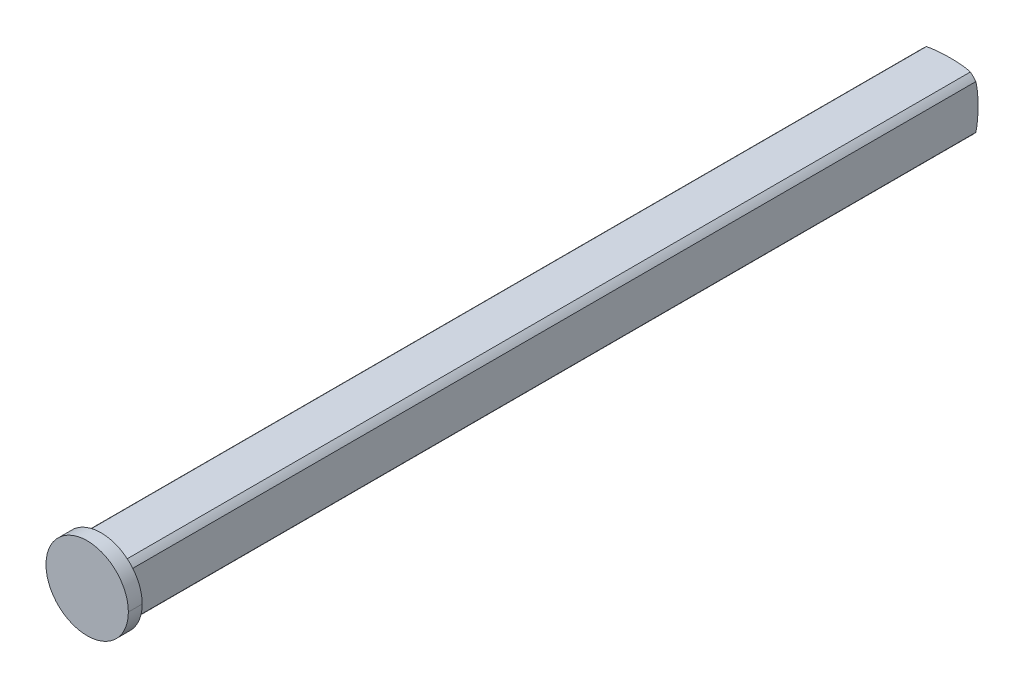
ISO-10303-21;
HEADER;
FILE_DESCRIPTION(('STEP AP214'),'2;1');
FILE_NAME('part.step','',(''),(''),'','','');
FILE_SCHEMA(('AUTOMOTIVE_DESIGN { 1 0 10303 214 1 1 1 1 }'));
ENDSEC;
DATA;
#1=APPLICATION_CONTEXT('core data for automotive mechanical design processes');
#2=APPLICATION_PROTOCOL_DEFINITION('international standard','automotive_design',2000,#1);
#3=PRODUCT_CONTEXT('',#1,'mechanical');
#4=PRODUCT('Part','Part','',(#3));
#5=PRODUCT_RELATED_PRODUCT_CATEGORY('part','',(#4));
#6=PRODUCT_DEFINITION_FORMATION('','',#4);
#7=PRODUCT_DEFINITION_CONTEXT('part definition',#1,'design');
#8=PRODUCT_DEFINITION('design','',#6,#7);
#9=PRODUCT_DEFINITION_SHAPE('','',#8);
#10=(LENGTH_UNIT() NAMED_UNIT(*) SI_UNIT(.MILLI.,.METRE.));
#11=(NAMED_UNIT(*) PLANE_ANGLE_UNIT() SI_UNIT($,.RADIAN.));
#12=(NAMED_UNIT(*) SI_UNIT($,.STERADIAN.) SOLID_ANGLE_UNIT());
#13=UNCERTAINTY_MEASURE_WITH_UNIT(LENGTH_MEASURE(1.E-05),#10,'distance_accuracy_value','');
#14=(GEOMETRIC_REPRESENTATION_CONTEXT(3) GLOBAL_UNCERTAINTY_ASSIGNED_CONTEXT((#13)) GLOBAL_UNIT_ASSIGNED_CONTEXT((#10,
#11,#12)) REPRESENTATION_CONTEXT('',''));
#15=CARTESIAN_POINT('',(0.,0.,0.));
#16=DIRECTION('',(0.,0.,1.));
#17=DIRECTION('',(1.,0.,0.));
#18=AXIS2_PLACEMENT_3D('',#15,#16,#17);
#19=CARTESIAN_POINT('',(0.,0.,0.));
#20=DIRECTION('',(0.,0.,1.));
#21=DIRECTION('',(1.,0.,0.));
#22=AXIS2_PLACEMENT_3D('',#19,#20,#21);
#23=PLANE('',#22);
#24=CARTESIAN_POINT('',(0.,0.,0.));
#25=DIRECTION('',(0.,0.,1.));
#26=DIRECTION('',(1.,0.,0.));
#27=AXIS2_PLACEMENT_3D('',#24,#25,#26);
#28=CIRCLE('',#27,2.375);
#29=CARTESIAN_POINT('',(-2.375,0.,0.));
#30=VERTEX_POINT('',#29);
#31=CARTESIAN_POINT('',(2.375,0.,0.));
#32=VERTEX_POINT('',#31);
#33=EDGE_CURVE('P0_E11',#30,#32,#28,.T.);
#34=ORIENTED_EDGE('',*,*,#33,.F.);
#35=CARTESIAN_POINT('',(0.,0.,0.));
#36=DIRECTION('',(0.,0.,1.));
#37=DIRECTION('',(1.,0.,0.));
#38=AXIS2_PLACEMENT_3D('',#35,#36,#37);
#39=CIRCLE('',#38,2.375);
#40=EDGE_CURVE('P0_E67',#32,#30,#39,.T.);
#41=ORIENTED_EDGE('',*,*,#40,.F.);
#42=EDGE_LOOP('',(#34,#41));
#43=FACE_BOUND('',#42,.T.);
#44=ADVANCED_FACE('P0_F17',(#43),#23,.F.);
#45=CARTESIAN_POINT('',(0.,0.,0.8));
#46=DIRECTION('',(0.,0.,1.));
#47=DIRECTION('',(1.,0.,0.));
#48=AXIS2_PLACEMENT_3D('',#45,#46,#47);
#49=PLANE('',#48);
#50=CARTESIAN_POINT('',(0.,0.,0.8));
#51=DIRECTION('',(0.,0.,1.));
#52=DIRECTION('',(1.,0.,0.));
#53=AXIS2_PLACEMENT_3D('',#50,#51,#52);
#54=CIRCLE('',#53,2.375);
#55=CARTESIAN_POINT('',(-2.375,0.,0.8));
#56=VERTEX_POINT('',#55);
#57=CARTESIAN_POINT('',(2.375,0.,0.8));
#58=VERTEX_POINT('',#57);
#59=EDGE_CURVE('P0_E29',#56,#58,#54,.T.);
#60=ORIENTED_EDGE('',*,*,#59,.T.);
#61=CARTESIAN_POINT('',(0.,0.,0.8));
#62=DIRECTION('',(0.,0.,1.));
#63=DIRECTION('',(1.,0.,0.));
#64=AXIS2_PLACEMENT_3D('',#61,#62,#63);
#65=CIRCLE('',#64,2.375);
#66=EDGE_CURVE('P0_E65',#58,#56,#65,.T.);
#67=ORIENTED_EDGE('',*,*,#66,.T.);
#68=EDGE_LOOP('',(#60,#67));
#69=FACE_BOUND('',#68,.T.);
#70=ADVANCED_FACE('P0_F66',(#69),#49,.T.);
#71=CARTESIAN_POINT('',(0.,0.,0.8));
#72=DIRECTION('',(0.,0.,-1.));
#73=DIRECTION('',(-1.,0.,0.));
#74=AXIS2_PLACEMENT_3D('',#71,#72,#73);
#75=CYLINDRICAL_SURFACE('',#74,2.375);
#76=DIRECTION('',(0.,0.,-1.));
#77=VECTOR('',#76,1.);
#78=CARTESIAN_POINT('',(2.375,0.,0.8));
#79=LINE('',#78,#77);
#80=EDGE_CURVE('P0_E21',#58,#32,#79,.T.);
#81=ORIENTED_EDGE('',*,*,#80,.F.);
#82=ORIENTED_EDGE('',*,*,#59,.F.);
#83=DIRECTION('',(0.,0.,-1.));
#84=VECTOR('',#83,1.);
#85=CARTESIAN_POINT('',(-2.375,0.,0.8));
#86=LINE('',#85,#84);
#87=EDGE_CURVE('P0_E56',#56,#30,#86,.T.);
#88=ORIENTED_EDGE('',*,*,#87,.T.);
#89=ORIENTED_EDGE('',*,*,#33,.T.);
#90=EDGE_LOOP('',(#81,#82,#88,#89));
#91=FACE_BOUND('',#90,.T.);
#92=ADVANCED_FACE('P0_F59',(#91),#75,.T.);
#93=CARTESIAN_POINT('',(0.,0.,0.8));
#94=DIRECTION('',(0.,0.,-1.));
#95=DIRECTION('',(-1.,0.,0.));
#96=AXIS2_PLACEMENT_3D('',#93,#94,#95);
#97=CYLINDRICAL_SURFACE('',#96,2.375);
#98=ORIENTED_EDGE('',*,*,#66,.F.);
#99=ORIENTED_EDGE('',*,*,#80,.T.);
#100=ORIENTED_EDGE('',*,*,#40,.T.);
#101=ORIENTED_EDGE('',*,*,#87,.F.);
#102=EDGE_LOOP('',(#98,#99,#100,#101));
#103=FACE_BOUND('',#102,.T.);
#104=ADVANCED_FACE('P0_F19',(#103),#97,.T.);
#105=CLOSED_SHELL('',(#44,#70,#92,#104));
#106=MANIFOLD_SOLID_BREP('P0_B1',#105);
#107=CARTESIAN_POINT('',(0.,0.,-49.022));
#108=DIRECTION('',(0.,0.,1.));
#109=DIRECTION('',(1.,0.,0.));
#110=AXIS2_PLACEMENT_3D('',#107,#108,#109);
#111=CYLINDRICAL_SURFACE('',#110,2.032);
#112=DIRECTION('',(0.,0.,-1.));
#113=VECTOR('',#112,1.);
#114=CARTESIAN_POINT('',(1.5875,1.26841150657032,-49.022));
#115=LINE('',#114,#113);
#116=CARTESIAN_POINT('',(1.5875,1.26841150657032,0.));
#117=VERTEX_POINT('',#116);
#118=CARTESIAN_POINT('',(1.5875,1.26841150657032,-48.870919142098));
#119=VERTEX_POINT('',#118);
#120=EDGE_CURVE('P1_E360',#117,#119,#115,.T.);
#121=ORIENTED_EDGE('',*,*,#120,.T.);
#122=CARTESIAN_POINT('',(0.,0.,-48.870919142098));
#123=DIRECTION('',(0.,0.,1.));
#124=DIRECTION('',(1.,0.,0.));
#125=AXIS2_PLACEMENT_3D('',#122,#123,#124);
#126=CIRCLE('',#125,2.032);
#127=CARTESIAN_POINT('',(1.26841150657032,1.5875,-48.870919142098));
#128=VERTEX_POINT('',#127);
#129=EDGE_CURVE('P1_E254',#119,#128,#126,.T.);
#130=ORIENTED_EDGE('',*,*,#129,.T.);
#131=DIRECTION('',(0.,0.,1.));
#132=VECTOR('',#131,1.);
#133=CARTESIAN_POINT('',(1.26841150657032,1.5875,-49.022));
#134=LINE('',#133,#132);
#135=CARTESIAN_POINT('',(1.26841150657032,1.5875,0.));
#136=VERTEX_POINT('',#135);
#137=EDGE_CURVE('P1_E227',#128,#136,#134,.T.);
#138=ORIENTED_EDGE('',*,*,#137,.T.);
#139=CARTESIAN_POINT('',(0.,0.,0.));
#140=DIRECTION('',(0.,0.,1.));
#141=DIRECTION('',(1.,0.,0.));
#142=AXIS2_PLACEMENT_3D('',#139,#140,#141);
#143=CIRCLE('',#142,2.032);
#144=EDGE_CURVE('P1_E412',#117,#136,#143,.T.);
#145=ORIENTED_EDGE('',*,*,#144,.F.);
#146=EDGE_LOOP('',(#121,#130,#138,#145));
#147=FACE_BOUND('',#146,.T.);
#148=ADVANCED_FACE('P1_F16',(#147),#111,.T.);
#149=CARTESIAN_POINT('',(0.,0.,-49.022));
#150=DIRECTION('',(0.,0.,1.));
#151=DIRECTION('',(1.,0.,0.));
#152=AXIS2_PLACEMENT_3D('',#149,#150,#151);
#153=CYLINDRICAL_SURFACE('',#152,2.032);
#154=DIRECTION('',(0.,0.,1.));
#155=VECTOR('',#154,1.);
#156=CARTESIAN_POINT('',(-1.5875,1.26841150657032,-49.022));
#157=LINE('',#156,#155);
#158=CARTESIAN_POINT('',(-1.5875,1.26841150657032,-48.870919142098));
#159=VERTEX_POINT('',#158);
#160=CARTESIAN_POINT('',(-1.5875,1.26841150657032,0.));
#161=VERTEX_POINT('',#160);
#162=EDGE_CURVE('P1_E199',#159,#161,#157,.T.);
#163=ORIENTED_EDGE('',*,*,#162,.T.);
#164=CARTESIAN_POINT('',(0.,0.,0.));
#165=DIRECTION('',(0.,0.,1.));
#166=DIRECTION('',(1.,0.,0.));
#167=AXIS2_PLACEMENT_3D('',#164,#165,#166);
#168=CIRCLE('',#167,2.032);
#169=CARTESIAN_POINT('',(-1.26841150657032,1.5875,0.));
#170=VERTEX_POINT('',#169);
#171=EDGE_CURVE('P1_E45',#170,#161,#168,.T.);
#172=ORIENTED_EDGE('',*,*,#171,.F.);
#173=DIRECTION('',(0.,0.,-1.));
#174=VECTOR('',#173,1.);
#175=CARTESIAN_POINT('',(-1.26841150657032,1.5875,-49.022));
#176=LINE('',#175,#174);
#177=CARTESIAN_POINT('',(-1.26841150657032,1.5875,-48.870919142098));
#178=VERTEX_POINT('',#177);
#179=EDGE_CURVE('P1_E240',#170,#178,#176,.T.);
#180=ORIENTED_EDGE('',*,*,#179,.T.);
#181=CARTESIAN_POINT('',(0.,0.,-48.870919142098));
#182=DIRECTION('',(0.,0.,1.));
#183=DIRECTION('',(1.,0.,0.));
#184=AXIS2_PLACEMENT_3D('',#181,#182,#183);
#185=CIRCLE('',#184,2.032);
#186=EDGE_CURVE('P1_E244',#178,#159,#185,.T.);
#187=ORIENTED_EDGE('',*,*,#186,.T.);
#188=EDGE_LOOP('',(#163,#172,#180,#187));
#189=FACE_BOUND('',#188,.T.);
#190=ADVANCED_FACE('P1_F297',(#189),#153,.T.);
#191=CARTESIAN_POINT('',(0.,0.,-49.022));
#192=DIRECTION('',(0.,0.,1.));
#193=DIRECTION('',(1.,0.,0.));
#194=AXIS2_PLACEMENT_3D('',#191,#192,#193);
#195=CYLINDRICAL_SURFACE('',#194,2.032);
#196=DIRECTION('',(0.,0.,-1.));
#197=VECTOR('',#196,1.);
#198=CARTESIAN_POINT('',(-1.5875,-1.26841150657032,-49.022));
#199=LINE('',#198,#197);
#200=CARTESIAN_POINT('',(-1.5875,-1.26841150657032,0.));
#201=VERTEX_POINT('',#200);
#202=CARTESIAN_POINT('',(-1.5875,-1.26841150657032,-48.870919142098));
#203=VERTEX_POINT('',#202);
#204=EDGE_CURVE('P1_E118',#201,#203,#199,.T.);
#205=ORIENTED_EDGE('',*,*,#204,.T.);
#206=CARTESIAN_POINT('',(0.,0.,-48.870919142098));
#207=DIRECTION('',(0.,0.,1.));
#208=DIRECTION('',(1.,0.,0.));
#209=AXIS2_PLACEMENT_3D('',#206,#207,#208);
#210=CIRCLE('',#209,2.032);
#211=CARTESIAN_POINT('',(-1.26841150657032,-1.5875,-48.870919142098));
#212=VERTEX_POINT('',#211);
#213=EDGE_CURVE('P1_E10',#203,#212,#210,.T.);
#214=ORIENTED_EDGE('',*,*,#213,.T.);
#215=DIRECTION('',(0.,0.,1.));
#216=VECTOR('',#215,1.);
#217=CARTESIAN_POINT('',(-1.26841150657032,-1.5875,-49.022));
#218=LINE('',#217,#216);
#219=CARTESIAN_POINT('',(-1.26841150657032,-1.5875,0.));
#220=VERTEX_POINT('',#219);
#221=EDGE_CURVE('P1_E117',#212,#220,#218,.T.);
#222=ORIENTED_EDGE('',*,*,#221,.T.);
#223=CARTESIAN_POINT('',(0.,0.,0.));
#224=DIRECTION('',(0.,0.,1.));
#225=DIRECTION('',(1.,0.,0.));
#226=AXIS2_PLACEMENT_3D('',#223,#224,#225);
#227=CIRCLE('',#226,2.032);
#228=EDGE_CURVE('P1_E443',#201,#220,#227,.T.);
#229=ORIENTED_EDGE('',*,*,#228,.F.);
#230=EDGE_LOOP('',(#205,#214,#222,#229));
#231=FACE_BOUND('',#230,.T.);
#232=ADVANCED_FACE('P1_F113',(#231),#195,.T.);
#233=CARTESIAN_POINT('',(0.,0.,-49.022));
#234=DIRECTION('',(0.,0.,1.));
#235=DIRECTION('',(1.,0.,0.));
#236=AXIS2_PLACEMENT_3D('',#233,#234,#235);
#237=CYLINDRICAL_SURFACE('',#236,2.032);
#238=DIRECTION('',(0.,0.,-1.));
#239=VECTOR('',#238,1.);
#240=CARTESIAN_POINT('',(1.26841150657032,-1.5875,-49.022));
#241=LINE('',#240,#239);
#242=CARTESIAN_POINT('',(1.26841150657032,-1.5875,0.));
#243=VERTEX_POINT('',#242);
#244=CARTESIAN_POINT('',(1.26841150657032,-1.5875,-48.870919142098));
#245=VERTEX_POINT('',#244);
#246=EDGE_CURVE('P1_E132',#243,#245,#241,.T.);
#247=ORIENTED_EDGE('',*,*,#246,.T.);
#248=CARTESIAN_POINT('',(0.,0.,-48.870919142098));
#249=DIRECTION('',(0.,0.,1.));
#250=DIRECTION('',(1.,0.,0.));
#251=AXIS2_PLACEMENT_3D('',#248,#249,#250);
#252=CIRCLE('',#251,2.032);
#253=CARTESIAN_POINT('',(1.5875,-1.26841150657032,-48.870919142098));
#254=VERTEX_POINT('',#253);
#255=EDGE_CURVE('P1_E30',#245,#254,#252,.T.);
#256=ORIENTED_EDGE('',*,*,#255,.T.);
#257=DIRECTION('',(0.,0.,1.));
#258=VECTOR('',#257,1.);
#259=CARTESIAN_POINT('',(1.5875,-1.26841150657032,-49.022));
#260=LINE('',#259,#258);
#261=CARTESIAN_POINT('',(1.5875,-1.26841150657032,0.));
#262=VERTEX_POINT('',#261);
#263=EDGE_CURVE('P1_E366',#254,#262,#260,.T.);
#264=ORIENTED_EDGE('',*,*,#263,.T.);
#265=CARTESIAN_POINT('',(0.,0.,0.));
#266=DIRECTION('',(0.,0.,1.));
#267=DIRECTION('',(1.,0.,0.));
#268=AXIS2_PLACEMENT_3D('',#265,#266,#267);
#269=CIRCLE('',#268,2.032);
#270=EDGE_CURVE('P1_E417',#243,#262,#269,.T.);
#271=ORIENTED_EDGE('',*,*,#270,.F.);
#272=EDGE_LOOP('',(#247,#256,#264,#271));
#273=FACE_BOUND('',#272,.T.);
#274=ADVANCED_FACE('P1_F18',(#273),#237,.T.);
#275=CARTESIAN_POINT('',(-1.5875,1.5875,-49.022));
#276=DIRECTION('',(0.,0.,-1.));
#277=DIRECTION('',(0.,-1.,0.));
#278=AXIS2_PLACEMENT_3D('',#275,#276,#277);
#279=PLANE('',#278);
#280=CARTESIAN_POINT('',(0.,0.,-49.022));
#281=DIRECTION('',(0.,0.,1.));
#282=DIRECTION('',(1.,0.,0.));
#283=AXIS2_PLACEMENT_3D('',#280,#281,#282);
#284=CIRCLE('',#283,1.24506403026729);
#285=CARTESIAN_POINT('',(1.24506403026729,0.,-49.022));
#286=VERTEX_POINT('',#285);
#287=CARTESIAN_POINT('',(-1.24506403026729,0.,-49.022));
#288=VERTEX_POINT('',#287);
#289=EDGE_CURVE('P1_E261',#286,#288,#284,.T.);
#290=ORIENTED_EDGE('',*,*,#289,.F.);
#291=CARTESIAN_POINT('',(0.,0.,-49.022));
#292=DIRECTION('',(0.,0.,1.));
#293=DIRECTION('',(1.,0.,0.));
#294=AXIS2_PLACEMENT_3D('',#291,#292,#293);
#295=CIRCLE('',#294,1.24506403026729);
#296=EDGE_CURVE('P1_E418',#288,#286,#295,.T.);
#297=ORIENTED_EDGE('',*,*,#296,.F.);
#298=EDGE_LOOP('',(#290,#297));
#299=FACE_BOUND('',#298,.T.);
#300=ADVANCED_FACE('P1_F211',(#299),#279,.T.);
#301=CARTESIAN_POINT('',(0.,0.,-46.897));
#302=DIRECTION('',(0.,0.,1.));
#303=DIRECTION('',(1.,0.,0.));
#304=AXIS2_PLACEMENT_3D('',#301,#302,#303);
#305=DEGENERATE_TOROIDAL_SURFACE('',#304,1.24506403026729,2.125,.T.);
#306=CARTESIAN_POINT('',(-1.24506403026729,0.,-46.897));
#307=DIRECTION('',(0.,1.,0.));
#308=DIRECTION('',(-1.,0.,0.));
#309=AXIS2_PLACEMENT_3D('',#306,#307,#308);
#310=CIRCLE('',#309,2.125);
#311=CARTESIAN_POINT('',(-1.5875,0.,-48.9942273616929));
#312=VERTEX_POINT('',#311);
#313=EDGE_CURVE('P1_E258',#288,#312,#310,.T.);
#314=ORIENTED_EDGE('',*,*,#313,.F.);
#315=ORIENTED_EDGE('',*,*,#296,.T.);
#316=CARTESIAN_POINT('',(1.24506403026729,0.,-46.897));
#317=DIRECTION('',(0.,-1.,0.));
#318=DIRECTION('',(0.,0.,-1.));
#319=AXIS2_PLACEMENT_3D('',#316,#317,#318);
#320=CIRCLE('',#319,2.125);
#321=CARTESIAN_POINT('',(1.5875,0.,-48.9942273616929));
#322=VERTEX_POINT('',#321);
#323=EDGE_CURVE('P1_E382',#286,#322,#320,.T.);
#324=ORIENTED_EDGE('',*,*,#323,.T.);
#325=CARTESIAN_POINT('',(1.5875,-1.26841150657032,-48.870919142098));
#326=CARTESIAN_POINT('',(1.5875,-0.98707709495539,-48.9409306391243));
#327=CARTESIAN_POINT('',(1.5875,-0.63953045901757,-48.9701819538897));
#328=CARTESIAN_POINT('',(1.5875,-0.353837297572546,-48.9942273616929));
#329=CARTESIAN_POINT('',(1.5875,0.,-48.9942273616929));
#330=B_SPLINE_CURVE_WITH_KNOTS('',2,(#325,#326,#327,#328,#329),.UNSPECIFIED.,.F.,.F.,(3,2,3),
(0.,0.5,1.),.UNSPECIFIED.);
#331=EDGE_CURVE('P1_E311',#254,#322,#330,.T.);
#332=ORIENTED_EDGE('',*,*,#331,.F.);
#333=ORIENTED_EDGE('',*,*,#255,.F.);
#334=CARTESIAN_POINT('',(-1.26841150657032,-1.5875,-48.870919142098));
#335=CARTESIAN_POINT('',(-0.77033823224327,-1.5875,-48.9948672057716));
#336=CARTESIAN_POINT('',(0.00849337593367507,-1.5875,-48.9942236517902));
#337=CARTESIAN_POINT('',(0.775470990365855,-1.5875,-48.9935898928465));
#338=CARTESIAN_POINT('',(1.26841150657033,-1.5875,-48.870919142098));
#339=B_SPLINE_CURVE_WITH_KNOTS('',2,(#334,#335,#336,#337,#338),.UNSPECIFIED.,.F.,.F.,(3,2,3),
(0.,0.5,1.),.UNSPECIFIED.);
#340=EDGE_CURVE('P1_E124',#212,#245,#339,.T.);
#341=ORIENTED_EDGE('',*,*,#340,.F.);
#342=ORIENTED_EDGE('',*,*,#213,.F.);
#343=CARTESIAN_POINT('',(-1.5875,0.,-48.9942273616929));
#344=CARTESIAN_POINT('',(-1.5875,-0.3531799573705,-48.9942273616929));
#345=CARTESIAN_POINT('',(-1.5875,-0.639529322286498,-48.9701820494506));
#346=CARTESIAN_POINT('',(-1.5875,-0.986669843225385,-48.941031985785));
#347=CARTESIAN_POINT('',(-1.5875,-1.26841150657032,-48.870919142098));
#348=B_SPLINE_CURVE_WITH_KNOTS('',2,(#343,#344,#345,#346,#347),.UNSPECIFIED.,.F.,.F.,(3,2,3),
(0.,0.5,1.),.UNSPECIFIED.);
#349=EDGE_CURVE('P1_E165',#312,#203,#348,.T.);
#350=ORIENTED_EDGE('',*,*,#349,.F.);
#351=EDGE_LOOP('',(#314,#315,#324,#332,#333,#341,#342,#350));
#352=FACE_BOUND('',#351,.T.);
#353=ADVANCED_FACE('P1_F130',(#352),#305,.T.);
#354=CARTESIAN_POINT('',(-1.5875,1.5875,0.));
#355=DIRECTION('',(0.,0.,-1.));
#356=DIRECTION('',(0.,-1.,0.));
#357=AXIS2_PLACEMENT_3D('',#354,#355,#356);
#358=PLANE('',#357);
#359=ORIENTED_EDGE('',*,*,#171,.T.);
#360=DIRECTION('',(0.,-1.,0.));
#361=VECTOR('',#360,1.);
#362=CARTESIAN_POINT('',(-1.5875,-1.5875,0.));
#363=LINE('',#362,#361);
#364=EDGE_CURVE('P1_E143',#161,#201,#363,.T.);
#365=ORIENTED_EDGE('',*,*,#364,.T.);
#366=ORIENTED_EDGE('',*,*,#228,.T.);
#367=DIRECTION('',(1.,0.,0.));
#368=VECTOR('',#367,1.);
#369=CARTESIAN_POINT('',(-1.5875,-1.5875,0.));
#370=LINE('',#369,#368);
#371=EDGE_CURVE('P1_E137',#220,#243,#370,.T.);
#372=ORIENTED_EDGE('',*,*,#371,.T.);
#373=ORIENTED_EDGE('',*,*,#270,.T.);
#374=DIRECTION('',(0.,1.,0.));
#375=VECTOR('',#374,1.);
#376=CARTESIAN_POINT('',(1.5875,-1.5875,0.));
#377=LINE('',#376,#375);
#378=EDGE_CURVE('P1_E236',#262,#117,#377,.T.);
#379=ORIENTED_EDGE('',*,*,#378,.T.);
#380=ORIENTED_EDGE('',*,*,#144,.T.);
#381=DIRECTION('',(-1.,0.,0.));
#382=VECTOR('',#381,1.);
#383=CARTESIAN_POINT('',(-1.5875,1.5875,0.));
#384=LINE('',#383,#382);
#385=EDGE_CURVE('P1_E245',#136,#170,#384,.T.);
#386=ORIENTED_EDGE('',*,*,#385,.T.);
#387=EDGE_LOOP('',(#359,#365,#366,#372,#373,#379,#380,#386));
#388=FACE_BOUND('',#387,.T.);
#389=ADVANCED_FACE('P1_F209',(#388),#358,.F.);
#390=CARTESIAN_POINT('',(-1.5875,1.5875,0.));
#391=DIRECTION('',(0.,-1.,0.));
#392=DIRECTION('',(0.,0.,-1.));
#393=AXIS2_PLACEMENT_3D('',#390,#391,#392);
#394=PLANE('',#393);
#395=ORIENTED_EDGE('',*,*,#137,.F.);
#396=CARTESIAN_POINT('',(1.26841150657033,1.5875,-48.870919142098));
#397=CARTESIAN_POINT('',(0.77033823224327,1.5875,-48.9948672057716));
#398=CARTESIAN_POINT('',(-0.00849337593367486,1.5875,-48.9942236517902));
#399=CARTESIAN_POINT('',(-0.775470990365852,1.5875,-48.9935898928465));
#400=CARTESIAN_POINT('',(-1.26841150657032,1.5875,-48.870919142098));
#401=B_SPLINE_CURVE_WITH_KNOTS('',2,(#396,#397,#398,#399,#400),.UNSPECIFIED.,.F.,.F.,(3,2,3),
(0.,0.5,1.),.UNSPECIFIED.);
#402=EDGE_CURVE('P1_E248',#128,#178,#401,.T.);
#403=ORIENTED_EDGE('',*,*,#402,.T.);
#404=ORIENTED_EDGE('',*,*,#179,.F.);
#405=ORIENTED_EDGE('',*,*,#385,.F.);
#406=EDGE_LOOP('',(#395,#403,#404,#405));
#407=FACE_BOUND('',#406,.T.);
#408=ADVANCED_FACE('P1_F300',(#407),#394,.F.);
#409=CARTESIAN_POINT('',(1.5875,-1.5875,0.));
#410=DIRECTION('',(-1.,0.,0.));
#411=DIRECTION('',(0.,0.,1.));
#412=AXIS2_PLACEMENT_3D('',#409,#410,#411);
#413=PLANE('',#412);
#414=ORIENTED_EDGE('',*,*,#263,.F.);
#415=ORIENTED_EDGE('',*,*,#331,.T.);
#416=CARTESIAN_POINT('',(1.5875,0.,-48.9942273616929));
#417=CARTESIAN_POINT('',(1.5875,0.353179957327135,-48.9942273616929));
#418=CARTESIAN_POINT('',(1.5875,0.6395293222865,-48.9701820494507));
#419=CARTESIAN_POINT('',(1.5875,0.986669843198365,-48.9410319857918));
#420=CARTESIAN_POINT('',(1.5875,1.26841150657033,-48.870919142098));
#421=B_SPLINE_CURVE_WITH_KNOTS('',2,(#416,#417,#418,#419,#420),.UNSPECIFIED.,.F.,.F.,(3,2,3),
(0.,0.5,1.),.UNSPECIFIED.);
#422=EDGE_CURVE('P1_E283',#322,#119,#421,.T.);
#423=ORIENTED_EDGE('',*,*,#422,.T.);
#424=ORIENTED_EDGE('',*,*,#120,.F.);
#425=ORIENTED_EDGE('',*,*,#378,.F.);
#426=EDGE_LOOP('',(#414,#415,#423,#424,#425));
#427=FACE_BOUND('',#426,.T.);
#428=ADVANCED_FACE('P1_F289',(#427),#413,.F.);
#429=CARTESIAN_POINT('',(-1.5875,-1.5875,0.));
#430=DIRECTION('',(0.,1.,0.));
#431=DIRECTION('',(1.,0.,0.));
#432=AXIS2_PLACEMENT_3D('',#429,#430,#431);
#433=PLANE('',#432);
#434=ORIENTED_EDGE('',*,*,#221,.F.);
#435=ORIENTED_EDGE('',*,*,#340,.T.);
#436=ORIENTED_EDGE('',*,*,#246,.F.);
#437=ORIENTED_EDGE('',*,*,#371,.F.);
#438=EDGE_LOOP('',(#434,#435,#436,#437));
#439=FACE_BOUND('',#438,.T.);
#440=ADVANCED_FACE('P1_F140',(#439),#433,.F.);
#441=CARTESIAN_POINT('',(-1.5875,-1.5875,0.));
#442=DIRECTION('',(1.,0.,0.));
#443=DIRECTION('',(0.,1.,0.));
#444=AXIS2_PLACEMENT_3D('',#441,#442,#443);
#445=PLANE('',#444);
#446=ORIENTED_EDGE('',*,*,#162,.F.);
#447=CARTESIAN_POINT('',(-1.5875,1.26841150657033,-48.870919142098));
#448=CARTESIAN_POINT('',(-1.5875,0.987077094955375,-48.9409306391243));
#449=CARTESIAN_POINT('',(-1.5875,0.63953045901757,-48.9701819538897));
#450=CARTESIAN_POINT('',(-1.5875,0.35383729757252,-48.9942273616929));
#451=CARTESIAN_POINT('',(-1.5875,0.,-48.9942273616929));
#452=B_SPLINE_CURVE_WITH_KNOTS('',2,(#447,#448,#449,#450,#451),.UNSPECIFIED.,.F.,.F.,(3,2,3),
(0.,0.5,1.),.UNSPECIFIED.);
#453=EDGE_CURVE('P1_E198',#159,#312,#452,.T.);
#454=ORIENTED_EDGE('',*,*,#453,.T.);
#455=ORIENTED_EDGE('',*,*,#349,.T.);
#456=ORIENTED_EDGE('',*,*,#204,.F.);
#457=ORIENTED_EDGE('',*,*,#364,.F.);
#458=EDGE_LOOP('',(#446,#454,#455,#456,#457));
#459=FACE_BOUND('',#458,.T.);
#460=ADVANCED_FACE('P1_F170',(#459),#445,.F.);
#461=CARTESIAN_POINT('',(0.,0.,-46.897));
#462=DIRECTION('',(0.,0.,1.));
#463=DIRECTION('',(1.,0.,0.));
#464=AXIS2_PLACEMENT_3D('',#461,#462,#463);
#465=DEGENERATE_TOROIDAL_SURFACE('',#464,1.24506403026729,2.125,.T.);
#466=ORIENTED_EDGE('',*,*,#289,.T.);
#467=ORIENTED_EDGE('',*,*,#313,.T.);
#468=ORIENTED_EDGE('',*,*,#453,.F.);
#469=ORIENTED_EDGE('',*,*,#186,.F.);
#470=ORIENTED_EDGE('',*,*,#402,.F.);
#471=ORIENTED_EDGE('',*,*,#129,.F.);
#472=ORIENTED_EDGE('',*,*,#422,.F.);
#473=ORIENTED_EDGE('',*,*,#323,.F.);
#474=EDGE_LOOP('',(#466,#467,#468,#469,#470,#471,#472,#473));
#475=FACE_BOUND('',#474,.T.);
#476=ADVANCED_FACE('P1_F177',(#475),#465,.T.);
#477=CLOSED_SHELL('',(#148,#190,#232,#274,#300,#353,#389,#408,#428,#440,#460,#476));
#478=MANIFOLD_SOLID_BREP('P1_B1',#477);
#479=ADVANCED_BREP_SHAPE_REPRESENTATION('',(#18,#106,#478),#14);
#480=SHAPE_DEFINITION_REPRESENTATION(#9,#479);
ENDSEC;
END-ISO-10303-21;
